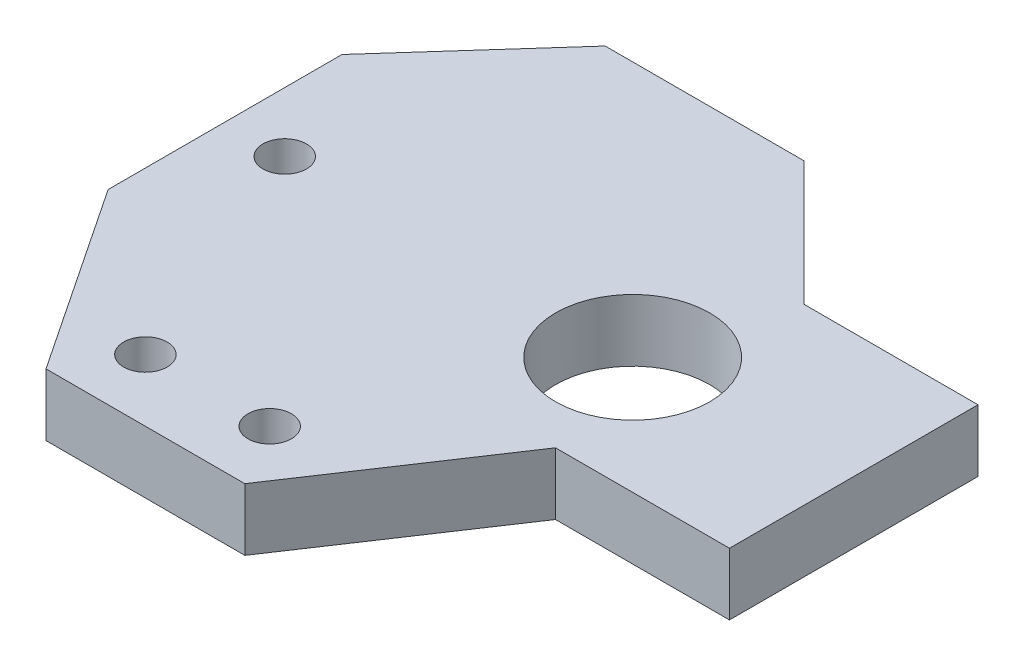
ISO-10303-21;
HEADER;
FILE_DESCRIPTION(('STEP AP214'),'2;1');
FILE_NAME('part.step','',(''),(''),'','','');
FILE_SCHEMA(('AUTOMOTIVE_DESIGN { 1 0 10303 214 1 1 1 1 }'));
ENDSEC;
DATA;
#1=APPLICATION_CONTEXT('core data for automotive mechanical design processes');
#2=APPLICATION_PROTOCOL_DEFINITION('international standard','automotive_design',2000,#1);
#3=PRODUCT_CONTEXT('',#1,'mechanical');
#4=PRODUCT('Part','Part','',(#3));
#5=PRODUCT_RELATED_PRODUCT_CATEGORY('part','',(#4));
#6=PRODUCT_DEFINITION_FORMATION('','',#4);
#7=PRODUCT_DEFINITION_CONTEXT('part definition',#1,'design');
#8=PRODUCT_DEFINITION('design','',#6,#7);
#9=PRODUCT_DEFINITION_SHAPE('','',#8);
#10=(LENGTH_UNIT() NAMED_UNIT(*) SI_UNIT(.MILLI.,.METRE.));
#11=(NAMED_UNIT(*) PLANE_ANGLE_UNIT() SI_UNIT($,.RADIAN.));
#12=(NAMED_UNIT(*) SI_UNIT($,.STERADIAN.) SOLID_ANGLE_UNIT());
#13=UNCERTAINTY_MEASURE_WITH_UNIT(LENGTH_MEASURE(1.E-05),#10,'distance_accuracy_value','');
#14=(GEOMETRIC_REPRESENTATION_CONTEXT(3) GLOBAL_UNCERTAINTY_ASSIGNED_CONTEXT((#13)) GLOBAL_UNIT_ASSIGNED_CONTEXT((#10,
#11,#12)) REPRESENTATION_CONTEXT('',''));
#15=CARTESIAN_POINT('',(0.,0.,0.));
#16=DIRECTION('',(0.,0.,1.));
#17=DIRECTION('',(1.,0.,0.));
#18=AXIS2_PLACEMENT_3D('',#15,#16,#17);
#19=CARTESIAN_POINT('',(50.,5.,0.));
#20=DIRECTION('',(-1.,0.,0.));
#21=DIRECTION('',(0.,0.,1.));
#22=AXIS2_PLACEMENT_3D('',#19,#20,#21);
#23=PLANE('',#22);
#24=DIRECTION('',(0.,0.,-1.));
#25=VECTOR('',#24,1.);
#26=CARTESIAN_POINT('',(50.,0.,0.));
#27=LINE('',#26,#25);
#28=CARTESIAN_POINT('',(50.,0.,-15.));
#29=VERTEX_POINT('',#28);
#30=CARTESIAN_POINT('',(50.,0.,-35.));
#31=VERTEX_POINT('',#30);
#32=EDGE_CURVE('E156',#29,#31,#27,.T.);
#33=ORIENTED_EDGE('',*,*,#32,.T.);
#34=DIRECTION('',(0.,-1.,0.));
#35=VECTOR('',#34,1.);
#36=CARTESIAN_POINT('',(50.,5.,-35.));
#37=LINE('',#36,#35);
#38=CARTESIAN_POINT('',(50.,5.,-35.));
#39=VERTEX_POINT('',#38);
#40=EDGE_CURVE('E11',#39,#31,#37,.T.);
#41=ORIENTED_EDGE('',*,*,#40,.F.);
#42=DIRECTION('',(0.,0.,-1.));
#43=VECTOR('',#42,1.);
#44=CARTESIAN_POINT('',(50.,5.,0.));
#45=LINE('',#44,#43);
#46=CARTESIAN_POINT('',(50.,5.,-15.));
#47=VERTEX_POINT('',#46);
#48=EDGE_CURVE('E103',#47,#39,#45,.T.);
#49=ORIENTED_EDGE('',*,*,#48,.F.);
#50=DIRECTION('',(0.,-1.,0.));
#51=VECTOR('',#50,1.);
#52=CARTESIAN_POINT('',(50.,5.,-15.));
#53=LINE('',#52,#51);
#54=EDGE_CURVE('E145',#47,#29,#53,.T.);
#55=ORIENTED_EDGE('',*,*,#54,.T.);
#56=EDGE_LOOP('',(#33,#41,#49,#55));
#57=FACE_BOUND('',#56,.T.);
#58=ADVANCED_FACE('F40',(#57),#23,.F.);
#59=CARTESIAN_POINT('',(0.,5.,-35.));
#60=DIRECTION('',(0.,0.,-1.));
#61=DIRECTION('',(-1.,0.,0.));
#62=AXIS2_PLACEMENT_3D('',#59,#60,#61);
#63=PLANE('',#62);
#64=DIRECTION('',(1.,0.,0.));
#65=VECTOR('',#64,1.);
#66=CARTESIAN_POINT('',(0.,0.,-35.));
#67=LINE('',#66,#65);
#68=CARTESIAN_POINT('',(36.,0.,-35.));
#69=VERTEX_POINT('',#68);
#70=EDGE_CURVE('E159',#69,#31,#67,.T.);
#71=ORIENTED_EDGE('',*,*,#70,.F.);
#72=DIRECTION('',(0.,-1.,0.));
#73=VECTOR('',#72,1.);
#74=CARTESIAN_POINT('',(36.,5.,-35.));
#75=LINE('',#74,#73);
#76=CARTESIAN_POINT('',(36.,5.,-35.));
#77=VERTEX_POINT('',#76);
#78=EDGE_CURVE('E49',#77,#69,#75,.T.);
#79=ORIENTED_EDGE('',*,*,#78,.F.);
#80=DIRECTION('',(1.,0.,0.));
#81=VECTOR('',#80,1.);
#82=CARTESIAN_POINT('',(0.,5.,-35.));
#83=LINE('',#82,#81);
#84=EDGE_CURVE('E212',#77,#39,#83,.T.);
#85=ORIENTED_EDGE('',*,*,#84,.T.);
#86=ORIENTED_EDGE('',*,*,#40,.T.);
#87=EDGE_LOOP('',(#71,#79,#85,#86));
#88=FACE_BOUND('',#87,.T.);
#89=ADVANCED_FACE('F199',(#88),#63,.T.);
#90=CARTESIAN_POINT('',(35.5,5.,-35.5));
#91=DIRECTION('',(0.707106781186547,0.,-0.707106781186548));
#92=DIRECTION('',(-0.707106781186548,0.,-0.707106781186547));
#93=AXIS2_PLACEMENT_3D('',#90,#91,#92);
#94=PLANE('',#93);
#95=DIRECTION('',(0.707106781186548,0.,0.707106781186547));
#96=VECTOR('',#95,1.);
#97=CARTESIAN_POINT('',(35.5,0.,-35.5));
#98=LINE('',#97,#96);
#99=CARTESIAN_POINT('',(26.,0.,-45.));
#100=VERTEX_POINT('',#99);
#101=EDGE_CURVE('E162',#100,#69,#98,.T.);
#102=ORIENTED_EDGE('',*,*,#101,.F.);
#103=DIRECTION('',(0.,-1.,0.));
#104=VECTOR('',#103,1.);
#105=CARTESIAN_POINT('',(26.,5.,-45.));
#106=LINE('',#105,#104);
#107=CARTESIAN_POINT('',(26.,5.,-45.));
#108=VERTEX_POINT('',#107);
#109=EDGE_CURVE('E189',#108,#100,#106,.T.);
#110=ORIENTED_EDGE('',*,*,#109,.F.);
#111=DIRECTION('',(0.707106781186548,0.,0.707106781186547));
#112=VECTOR('',#111,1.);
#113=CARTESIAN_POINT('',(35.5,5.,-35.5));
#114=LINE('',#113,#112);
#115=EDGE_CURVE('E196',#108,#77,#114,.T.);
#116=ORIENTED_EDGE('',*,*,#115,.T.);
#117=ORIENTED_EDGE('',*,*,#78,.T.);
#118=EDGE_LOOP('',(#102,#110,#116,#117));
#119=FACE_BOUND('',#118,.T.);
#120=ADVANCED_FACE('F194',(#119),#94,.T.);
#121=CARTESIAN_POINT('',(0.,5.,-45.));
#122=DIRECTION('',(0.,0.,-1.));
#123=DIRECTION('',(-1.,0.,0.));
#124=AXIS2_PLACEMENT_3D('',#121,#122,#123);
#125=PLANE('',#124);
#126=DIRECTION('',(1.,0.,0.));
#127=VECTOR('',#126,1.);
#128=CARTESIAN_POINT('',(0.,0.,-45.));
#129=LINE('',#128,#127);
#130=CARTESIAN_POINT('',(10.,0.,-45.));
#131=VERTEX_POINT('',#130);
#132=EDGE_CURVE('E165',#131,#100,#129,.T.);
#133=ORIENTED_EDGE('',*,*,#132,.F.);
#134=DIRECTION('',(0.,-1.,0.));
#135=VECTOR('',#134,1.);
#136=CARTESIAN_POINT('',(10.,5.,-45.));
#137=LINE('',#136,#135);
#138=CARTESIAN_POINT('',(10.,5.,-45.));
#139=VERTEX_POINT('',#138);
#140=EDGE_CURVE('E187',#139,#131,#137,.T.);
#141=ORIENTED_EDGE('',*,*,#140,.F.);
#142=DIRECTION('',(1.,0.,0.));
#143=VECTOR('',#142,1.);
#144=CARTESIAN_POINT('',(0.,5.,-45.));
#145=LINE('',#144,#143);
#146=EDGE_CURVE('E209',#139,#108,#145,.T.);
#147=ORIENTED_EDGE('',*,*,#146,.T.);
#148=ORIENTED_EDGE('',*,*,#109,.T.);
#149=EDGE_LOOP('',(#133,#141,#147,#148));
#150=FACE_BOUND('',#149,.T.);
#151=ADVANCED_FACE('F206',(#150),#125,.T.);
#152=CARTESIAN_POINT('',(-16.8051242194423,5.,-15.0309600500005));
#153=DIRECTION('',(-0.74535599249993,0.,-0.666666666666667));
#154=DIRECTION('',(-0.666666666666667,0.,0.74535599249993));
#155=AXIS2_PLACEMENT_3D('',#152,#153,#154);
#156=PLANE('',#155);
#157=DIRECTION('',(0.666666666666667,0.,-0.74535599249993));
#158=VECTOR('',#157,1.);
#159=CARTESIAN_POINT('',(-16.8051242194423,0.,-15.0309600500005));
#160=LINE('',#159,#158);
#161=CARTESIAN_POINT('',(0.,0.,-33.8196601125011));
#162=VERTEX_POINT('',#161);
#163=EDGE_CURVE('E168',#162,#131,#160,.T.);
#164=ORIENTED_EDGE('',*,*,#163,.F.);
#165=DIRECTION('',(0.,-1.,0.));
#166=VECTOR('',#165,1.);
#167=CARTESIAN_POINT('',(0.,5.,-33.8196601125011));
#168=LINE('',#167,#166);
#169=CARTESIAN_POINT('',(0.,5.,-33.8196601125011));
#170=VERTEX_POINT('',#169);
#171=EDGE_CURVE('E185',#170,#162,#168,.T.);
#172=ORIENTED_EDGE('',*,*,#171,.F.);
#173=DIRECTION('',(0.666666666666667,0.,-0.74535599249993));
#174=VECTOR('',#173,1.);
#175=CARTESIAN_POINT('',(-16.8051242194423,5.,-15.0309600500005));
#176=LINE('',#175,#174);
#177=EDGE_CURVE('E214',#170,#139,#176,.T.);
#178=ORIENTED_EDGE('',*,*,#177,.T.);
#179=ORIENTED_EDGE('',*,*,#140,.T.);
#180=EDGE_LOOP('',(#164,#172,#178,#179));
#181=FACE_BOUND('',#180,.T.);
#182=ADVANCED_FACE('F226',(#181),#156,.T.);
#183=CARTESIAN_POINT('',(0.,5.,0.));
#184=DIRECTION('',(-1.,0.,0.));
#185=DIRECTION('',(0.,0.,1.));
#186=AXIS2_PLACEMENT_3D('',#183,#184,#185);
#187=PLANE('',#186);
#188=DIRECTION('',(0.,0.,-1.));
#189=VECTOR('',#188,1.);
#190=CARTESIAN_POINT('',(0.,0.,0.));
#191=LINE('',#190,#189);
#192=CARTESIAN_POINT('',(0.,0.,-15.));
#193=VERTEX_POINT('',#192);
#194=EDGE_CURVE('E171',#193,#162,#191,.T.);
#195=ORIENTED_EDGE('',*,*,#194,.F.);
#196=DIRECTION('',(0.,-1.,0.));
#197=VECTOR('',#196,1.);
#198=CARTESIAN_POINT('',(0.,5.,-15.));
#199=LINE('',#198,#197);
#200=CARTESIAN_POINT('',(0.,5.,-15.));
#201=VERTEX_POINT('',#200);
#202=EDGE_CURVE('E183',#201,#193,#199,.T.);
#203=ORIENTED_EDGE('',*,*,#202,.F.);
#204=DIRECTION('',(0.,0.,-1.));
#205=VECTOR('',#204,1.);
#206=CARTESIAN_POINT('',(0.,5.,0.));
#207=LINE('',#206,#205);
#208=EDGE_CURVE('E220',#201,#170,#207,.T.);
#209=ORIENTED_EDGE('',*,*,#208,.T.);
#210=ORIENTED_EDGE('',*,*,#171,.T.);
#211=EDGE_LOOP('',(#195,#203,#209,#210));
#212=FACE_BOUND('',#211,.T.);
#213=ADVANCED_FACE('F224',(#212),#187,.T.);
#214=CARTESIAN_POINT('',(6.92307692307692,5.,-4.61538461538462));
#215=DIRECTION('',(0.832050294337844,0.,-0.554700196225229));
#216=DIRECTION('',(-0.554700196225229,0.,-0.832050294337844));
#217=AXIS2_PLACEMENT_3D('',#214,#215,#216);
#218=PLANE('',#217);
#219=DIRECTION('',(0.554700196225229,0.,0.832050294337844));
#220=VECTOR('',#219,1.);
#221=CARTESIAN_POINT('',(6.92307692307692,0.,-4.61538461538462));
#222=LINE('',#221,#220);
#223=CARTESIAN_POINT('',(10.,0.,0.));
#224=VERTEX_POINT('',#223);
#225=EDGE_CURVE('E174',#193,#224,#222,.T.);
#226=ORIENTED_EDGE('',*,*,#225,.T.);
#227=DIRECTION('',(0.,-1.,0.));
#228=VECTOR('',#227,1.);
#229=CARTESIAN_POINT('',(10.,5.,0.));
#230=LINE('',#229,#228);
#231=CARTESIAN_POINT('',(10.,5.,0.));
#232=VERTEX_POINT('',#231);
#233=EDGE_CURVE('E140',#232,#224,#230,.T.);
#234=ORIENTED_EDGE('',*,*,#233,.F.);
#235=DIRECTION('',(0.554700196225229,0.,0.832050294337844));
#236=VECTOR('',#235,1.);
#237=CARTESIAN_POINT('',(6.92307692307692,5.,-4.61538461538462));
#238=LINE('',#237,#236);
#239=EDGE_CURVE('E131',#201,#232,#238,.T.);
#240=ORIENTED_EDGE('',*,*,#239,.F.);
#241=ORIENTED_EDGE('',*,*,#202,.T.);
#242=EDGE_LOOP('',(#226,#234,#240,#241));
#243=FACE_BOUND('',#242,.T.);
#244=ADVANCED_FACE('F229',(#243),#218,.F.);
#245=CARTESIAN_POINT('',(0.,5.,0.));
#246=DIRECTION('',(0.,0.,-1.));
#247=DIRECTION('',(-1.,0.,0.));
#248=AXIS2_PLACEMENT_3D('',#245,#246,#247);
#249=PLANE('',#248);
#250=DIRECTION('',(1.,0.,0.));
#251=VECTOR('',#250,1.);
#252=CARTESIAN_POINT('',(0.,0.,0.));
#253=LINE('',#252,#251);
#254=CARTESIAN_POINT('',(26.,0.,0.));
#255=VERTEX_POINT('',#254);
#256=EDGE_CURVE('E139',#224,#255,#253,.T.);
#257=ORIENTED_EDGE('',*,*,#256,.T.);
#258=DIRECTION('',(0.,-1.,0.));
#259=VECTOR('',#258,1.);
#260=CARTESIAN_POINT('',(26.,5.,0.));
#261=LINE('',#260,#259);
#262=CARTESIAN_POINT('',(26.,5.,0.));
#263=VERTEX_POINT('',#262);
#264=EDGE_CURVE('E136',#263,#255,#261,.T.);
#265=ORIENTED_EDGE('',*,*,#264,.F.);
#266=DIRECTION('',(1.,0.,0.));
#267=VECTOR('',#266,1.);
#268=CARTESIAN_POINT('',(0.,5.,0.));
#269=LINE('',#268,#267);
#270=EDGE_CURVE('E124',#232,#263,#269,.T.);
#271=ORIENTED_EDGE('',*,*,#270,.F.);
#272=ORIENTED_EDGE('',*,*,#233,.T.);
#273=EDGE_LOOP('',(#257,#265,#271,#272));
#274=FACE_BOUND('',#273,.T.);
#275=ADVANCED_FACE('F137',(#274),#249,.F.);
#276=CARTESIAN_POINT('',(18.,5.,12.));
#277=DIRECTION('',(-0.832050294337844,0.,-0.554700196225229));
#278=DIRECTION('',(-0.554700196225229,0.,0.832050294337844));
#279=AXIS2_PLACEMENT_3D('',#276,#277,#278);
#280=PLANE('',#279);
#281=DIRECTION('',(0.554700196225229,0.,-0.832050294337844));
#282=VECTOR('',#281,1.);
#283=CARTESIAN_POINT('',(18.,0.,12.));
#284=LINE('',#283,#282);
#285=CARTESIAN_POINT('',(36.,0.,-15.));
#286=VERTEX_POINT('',#285);
#287=EDGE_CURVE('E91',#255,#286,#284,.T.);
#288=ORIENTED_EDGE('',*,*,#287,.T.);
#289=DIRECTION('',(0.,-1.,0.));
#290=VECTOR('',#289,1.);
#291=CARTESIAN_POINT('',(36.,5.,-15.));
#292=LINE('',#291,#290);
#293=CARTESIAN_POINT('',(36.,5.,-15.));
#294=VERTEX_POINT('',#293);
#295=EDGE_CURVE('E141',#294,#286,#292,.T.);
#296=ORIENTED_EDGE('',*,*,#295,.F.);
#297=DIRECTION('',(0.554700196225229,0.,-0.832050294337844));
#298=VECTOR('',#297,1.);
#299=CARTESIAN_POINT('',(18.,5.,12.));
#300=LINE('',#299,#298);
#301=EDGE_CURVE('E128',#263,#294,#300,.T.);
#302=ORIENTED_EDGE('',*,*,#301,.F.);
#303=ORIENTED_EDGE('',*,*,#264,.T.);
#304=EDGE_LOOP('',(#288,#296,#302,#303));
#305=FACE_BOUND('',#304,.T.);
#306=ADVANCED_FACE('F143',(#305),#280,.F.);
#307=CARTESIAN_POINT('',(23.,5.,-5.));
#308=DIRECTION('',(0.,-1.,0.));
#309=DIRECTION('',(0.,0.,-1.));
#310=AXIS2_PLACEMENT_3D('',#307,#308,#309);
#311=CYLINDRICAL_SURFACE('',#310,1.75);
#312=CARTESIAN_POINT('',(23.,5.,-5.));
#313=DIRECTION('',(0.,1.,0.));
#314=DIRECTION('',(0.,0.,1.));
#315=AXIS2_PLACEMENT_3D('',#312,#313,#314);
#316=CIRCLE('',#315,1.75);
#317=CARTESIAN_POINT('',(23.,5.,-3.25));
#318=VERTEX_POINT('',#317);
#319=EDGE_CURVE('E259',#318,#318,#316,.T.);
#320=ORIENTED_EDGE('',*,*,#319,.T.);
#321=EDGE_LOOP('',(#320));
#322=FACE_BOUND('',#321,.T.);
#323=CARTESIAN_POINT('',(23.,0.,-5.));
#324=DIRECTION('',(0.,1.,0.));
#325=DIRECTION('',(0.,0.,1.));
#326=AXIS2_PLACEMENT_3D('',#323,#324,#325);
#327=CIRCLE('',#326,1.75);
#328=CARTESIAN_POINT('',(23.,0.,-3.25));
#329=VERTEX_POINT('',#328);
#330=EDGE_CURVE('E152',#329,#329,#327,.T.);
#331=ORIENTED_EDGE('',*,*,#330,.F.);
#332=EDGE_LOOP('',(#331));
#333=FACE_BOUND('',#332,.T.);
#334=ADVANCED_FACE('F246',(#322,#333),#311,.F.);
#335=CARTESIAN_POINT('',(13.,5.,-5.));
#336=DIRECTION('',(0.,-1.,0.));
#337=DIRECTION('',(0.,0.,-1.));
#338=AXIS2_PLACEMENT_3D('',#335,#336,#337);
#339=CYLINDRICAL_SURFACE('',#338,1.75);
#340=CARTESIAN_POINT('',(13.,5.,-5.));
#341=DIRECTION('',(0.,1.,0.));
#342=DIRECTION('',(0.,0.,1.));
#343=AXIS2_PLACEMENT_3D('',#340,#341,#342);
#344=CIRCLE('',#343,1.75);
#345=CARTESIAN_POINT('',(13.,5.,-3.25));
#346=VERTEX_POINT('',#345);
#347=EDGE_CURVE('E179',#346,#346,#344,.T.);
#348=ORIENTED_EDGE('',*,*,#347,.T.);
#349=EDGE_LOOP('',(#348));
#350=FACE_BOUND('',#349,.T.);
#351=CARTESIAN_POINT('',(13.,0.,-5.));
#352=DIRECTION('',(0.,1.,0.));
#353=DIRECTION('',(0.,0.,1.));
#354=AXIS2_PLACEMENT_3D('',#351,#352,#353);
#355=CIRCLE('',#354,1.75);
#356=CARTESIAN_POINT('',(13.,0.,-3.25));
#357=VERTEX_POINT('',#356);
#358=EDGE_CURVE('E149',#357,#357,#355,.T.);
#359=ORIENTED_EDGE('',*,*,#358,.F.);
#360=EDGE_LOOP('',(#359));
#361=FACE_BOUND('',#360,.T.);
#362=ADVANCED_FACE('F42',(#350,#361),#339,.F.);
#363=CARTESIAN_POINT('',(0.,5.,-15.));
#364=DIRECTION('',(0.,0.,-1.));
#365=DIRECTION('',(-1.,0.,0.));
#366=AXIS2_PLACEMENT_3D('',#363,#364,#365);
#367=PLANE('',#366);
#368=DIRECTION('',(1.,0.,0.));
#369=VECTOR('',#368,1.);
#370=CARTESIAN_POINT('',(0.,0.,-15.));
#371=LINE('',#370,#369);
#372=EDGE_CURVE('E97',#286,#29,#371,.T.);
#373=ORIENTED_EDGE('',*,*,#372,.T.);
#374=ORIENTED_EDGE('',*,*,#54,.F.);
#375=DIRECTION('',(1.,0.,0.));
#376=VECTOR('',#375,1.);
#377=CARTESIAN_POINT('',(0.,5.,-15.));
#378=LINE('',#377,#376);
#379=EDGE_CURVE('E57',#294,#47,#378,.T.);
#380=ORIENTED_EDGE('',*,*,#379,.F.);
#381=ORIENTED_EDGE('',*,*,#295,.T.);
#382=EDGE_LOOP('',(#373,#374,#380,#381));
#383=FACE_BOUND('',#382,.T.);
#384=ADVANCED_FACE('F253',(#383),#367,.F.);
#385=CARTESIAN_POINT('',(0.,5.,0.));
#386=DIRECTION('',(0.,1.,0.));
#387=DIRECTION('',(0.,0.,1.));
#388=AXIS2_PLACEMENT_3D('',#385,#386,#387);
#389=PLANE('',#388);
#390=CARTESIAN_POINT('',(4.8,5.,-24.4098300562505));
#391=DIRECTION('',(0.,1.,0.));
#392=DIRECTION('',(0.,0.,1.));
#393=AXIS2_PLACEMENT_3D('',#390,#391,#392);
#394=CIRCLE('',#393,1.75);
#395=CARTESIAN_POINT('',(4.8,5.,-22.6598300562505));
#396=VERTEX_POINT('',#395);
#397=EDGE_CURVE('E153',#396,#396,#394,.T.);
#398=ORIENTED_EDGE('',*,*,#397,.F.);
#399=EDGE_LOOP('',(#398));
#400=FACE_BOUND('',#399,.T.);
#401=CARTESIAN_POINT('',(32.8,5.,-24.4098300562505));
#402=DIRECTION('',(0.,1.,0.));
#403=DIRECTION('',(0.,0.,1.));
#404=AXIS2_PLACEMENT_3D('',#401,#402,#403);
#405=CIRCLE('',#404,6.2);
#406=CARTESIAN_POINT('',(32.8,5.,-18.2098300562505));
#407=VERTEX_POINT('',#406);
#408=EDGE_CURVE('E318',#407,#407,#405,.T.);
#409=ORIENTED_EDGE('',*,*,#408,.F.);
#410=EDGE_LOOP('',(#409));
#411=FACE_BOUND('',#410,.T.);
#412=ORIENTED_EDGE('',*,*,#347,.F.);
#413=EDGE_LOOP('',(#412));
#414=FACE_BOUND('',#413,.T.);
#415=ORIENTED_EDGE('',*,*,#319,.F.);
#416=EDGE_LOOP('',(#415));
#417=FACE_BOUND('',#416,.T.);
#418=ORIENTED_EDGE('',*,*,#48,.T.);
#419=ORIENTED_EDGE('',*,*,#84,.F.);
#420=ORIENTED_EDGE('',*,*,#115,.F.);
#421=ORIENTED_EDGE('',*,*,#146,.F.);
#422=ORIENTED_EDGE('',*,*,#177,.F.);
#423=ORIENTED_EDGE('',*,*,#208,.F.);
#424=ORIENTED_EDGE('',*,*,#239,.T.);
#425=ORIENTED_EDGE('',*,*,#270,.T.);
#426=ORIENTED_EDGE('',*,*,#301,.T.);
#427=ORIENTED_EDGE('',*,*,#379,.T.);
#428=EDGE_LOOP('',(#418,#419,#420,#421,#422,#423,#424,#425,#426,#427));
#429=FACE_BOUND('',#428,.T.);
#430=ADVANCED_FACE('F126',(#400,#411,#414,#417,#429),#389,.T.);
#431=CARTESIAN_POINT('',(0.,0.,0.));
#432=DIRECTION('',(0.,1.,0.));
#433=DIRECTION('',(0.,0.,1.));
#434=AXIS2_PLACEMENT_3D('',#431,#432,#433);
#435=PLANE('',#434);
#436=CARTESIAN_POINT('',(4.8,0.,-24.4098300562505));
#437=DIRECTION('',(0.,-1.,0.));
#438=DIRECTION('',(0.,0.,-1.));
#439=AXIS2_PLACEMENT_3D('',#436,#437,#438);
#440=CIRCLE('',#439,1.75);
#441=CARTESIAN_POINT('',(4.8,0.,-26.1598300562505));
#442=VERTEX_POINT('',#441);
#443=EDGE_CURVE('E317',#442,#442,#440,.T.);
#444=ORIENTED_EDGE('',*,*,#443,.F.);
#445=EDGE_LOOP('',(#444));
#446=FACE_BOUND('',#445,.T.);
#447=CARTESIAN_POINT('',(32.8,0.,-24.4098300562505));
#448=DIRECTION('',(0.,-1.,0.));
#449=DIRECTION('',(0.,0.,-1.));
#450=AXIS2_PLACEMENT_3D('',#447,#448,#449);
#451=CIRCLE('',#450,6.2);
#452=CARTESIAN_POINT('',(32.8,0.,-30.6098300562505));
#453=VERTEX_POINT('',#452);
#454=EDGE_CURVE('E319',#453,#453,#451,.T.);
#455=ORIENTED_EDGE('',*,*,#454,.F.);
#456=EDGE_LOOP('',(#455));
#457=FACE_BOUND('',#456,.T.);
#458=ORIENTED_EDGE('',*,*,#358,.T.);
#459=EDGE_LOOP('',(#458));
#460=FACE_BOUND('',#459,.T.);
#461=ORIENTED_EDGE('',*,*,#330,.T.);
#462=EDGE_LOOP('',(#461));
#463=FACE_BOUND('',#462,.T.);
#464=ORIENTED_EDGE('',*,*,#32,.F.);
#465=ORIENTED_EDGE('',*,*,#372,.F.);
#466=ORIENTED_EDGE('',*,*,#287,.F.);
#467=ORIENTED_EDGE('',*,*,#256,.F.);
#468=ORIENTED_EDGE('',*,*,#225,.F.);
#469=ORIENTED_EDGE('',*,*,#194,.T.);
#470=ORIENTED_EDGE('',*,*,#163,.T.);
#471=ORIENTED_EDGE('',*,*,#132,.T.);
#472=ORIENTED_EDGE('',*,*,#101,.T.);
#473=ORIENTED_EDGE('',*,*,#70,.T.);
#474=EDGE_LOOP('',(#464,#465,#466,#467,#468,#469,#470,#471,#472,#473));
#475=FACE_BOUND('',#474,.T.);
#476=ADVANCED_FACE('F202',(#446,#457,#460,#463,#475),#435,.F.);
#477=CARTESIAN_POINT('',(32.8,10.,-24.4098300562505));
#478=DIRECTION('',(0.,-1.,0.));
#479=DIRECTION('',(0.,0.,-1.));
#480=AXIS2_PLACEMENT_3D('',#477,#478,#479);
#481=CYLINDRICAL_SURFACE('',#480,6.2);
#482=ORIENTED_EDGE('',*,*,#408,.T.);
#483=EDGE_LOOP('',(#482));
#484=FACE_BOUND('',#483,.T.);
#485=ORIENTED_EDGE('',*,*,#454,.T.);
#486=EDGE_LOOP('',(#485));
#487=FACE_BOUND('',#486,.T.);
#488=ADVANCED_FACE('F263',(#484,#487),#481,.F.);
#489=CARTESIAN_POINT('',(4.8,10.,-24.4098300562505));
#490=DIRECTION('',(0.,-1.,0.));
#491=DIRECTION('',(0.,0.,-1.));
#492=AXIS2_PLACEMENT_3D('',#489,#490,#491);
#493=CYLINDRICAL_SURFACE('',#492,1.75);
#494=ORIENTED_EDGE('',*,*,#397,.T.);
#495=EDGE_LOOP('',(#494));
#496=FACE_BOUND('',#495,.T.);
#497=ORIENTED_EDGE('',*,*,#443,.T.);
#498=EDGE_LOOP('',(#497));
#499=FACE_BOUND('',#498,.T.);
#500=ADVANCED_FACE('F270',(#496,#499),#493,.F.);
#501=CLOSED_SHELL('',(#58,#89,#120,#151,#182,#213,#244,#275,#306,#334,#362,#384,#430,#476,#488,#500));
#502=MANIFOLD_SOLID_BREP('B2',#501);
#503=ADVANCED_BREP_SHAPE_REPRESENTATION('',(#18,#502),#14);
#504=SHAPE_DEFINITION_REPRESENTATION(#9,#503);
ENDSEC;
END-ISO-10303-21;
